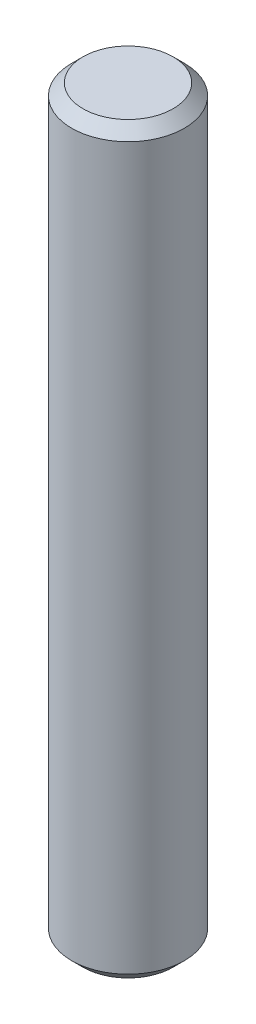
ISO-10303-21;
HEADER;
FILE_DESCRIPTION(('STEP AP214'),'2;1');
FILE_NAME('part.step','',(''),(''),'','','');
FILE_SCHEMA(('AUTOMOTIVE_DESIGN { 1 0 10303 214 1 1 1 1 }'));
ENDSEC;
DATA;
#1=APPLICATION_CONTEXT('core data for automotive mechanical design processes');
#2=APPLICATION_PROTOCOL_DEFINITION('international standard','automotive_design',2000,#1);
#3=PRODUCT_CONTEXT('',#1,'mechanical');
#4=PRODUCT('Part','Part','',(#3));
#5=PRODUCT_RELATED_PRODUCT_CATEGORY('part','',(#4));
#6=PRODUCT_DEFINITION_FORMATION('','',#4);
#7=PRODUCT_DEFINITION_CONTEXT('part definition',#1,'design');
#8=PRODUCT_DEFINITION('design','',#6,#7);
#9=PRODUCT_DEFINITION_SHAPE('','',#8);
#10=(LENGTH_UNIT() NAMED_UNIT(*) SI_UNIT(.MILLI.,.METRE.));
#11=(NAMED_UNIT(*) PLANE_ANGLE_UNIT() SI_UNIT($,.RADIAN.));
#12=(NAMED_UNIT(*) SI_UNIT($,.STERADIAN.) SOLID_ANGLE_UNIT());
#13=UNCERTAINTY_MEASURE_WITH_UNIT(LENGTH_MEASURE(1.E-05),#10,'distance_accuracy_value','');
#14=(GEOMETRIC_REPRESENTATION_CONTEXT(3) GLOBAL_UNCERTAINTY_ASSIGNED_CONTEXT((#13)) GLOBAL_UNIT_ASSIGNED_CONTEXT((#10,
#11,#12)) REPRESENTATION_CONTEXT('',''));
#15=CARTESIAN_POINT('',(0.,0.,0.));
#16=DIRECTION('',(0.,0.,1.));
#17=DIRECTION('',(1.,0.,0.));
#18=AXIS2_PLACEMENT_3D('',#15,#16,#17);
#19=CARTESIAN_POINT('',(0.,41.91,0.));
#20=DIRECTION('',(0.,-1.,0.));
#21=DIRECTION('',(0.,0.,-1.));
#22=AXIS2_PLACEMENT_3D('',#19,#20,#21);
#23=CYLINDRICAL_SURFACE('',#22,3.175);
#24=CARTESIAN_POINT('',(0.,0.635000000000004,0.));
#25=DIRECTION('',(0.,1.,0.));
#26=DIRECTION('',(0.,0.,1.));
#27=AXIS2_PLACEMENT_3D('',#24,#25,#26);
#28=CIRCLE('',#27,3.175);
#29=CARTESIAN_POINT('',(0.,0.635000000000004,3.175));
#30=VERTEX_POINT('',#29);
#31=EDGE_CURVE('E59',#30,#30,#28,.T.);
#32=ORIENTED_EDGE('',*,*,#31,.T.);
#33=EDGE_LOOP('',(#32));
#34=FACE_BOUND('',#33,.T.);
#35=CARTESIAN_POINT('',(0.,41.275,0.));
#36=DIRECTION('',(0.,1.,0.));
#37=DIRECTION('',(0.,0.,1.));
#38=AXIS2_PLACEMENT_3D('',#35,#36,#37);
#39=CIRCLE('',#38,3.175);
#40=CARTESIAN_POINT('',(0.,41.275,-3.175));
#41=VERTEX_POINT('',#40);
#42=EDGE_CURVE('E64',#41,#41,#39,.F.);
#43=ORIENTED_EDGE('',*,*,#42,.T.);
#44=EDGE_LOOP('',(#43));
#45=FACE_BOUND('',#44,.T.);
#46=ADVANCED_FACE('F45',(#34,#45),#23,.T.);
#47=CARTESIAN_POINT('',(0.,41.91,0.));
#48=DIRECTION('',(0.,1.,0.));
#49=DIRECTION('',(0.,0.,1.));
#50=AXIS2_PLACEMENT_3D('',#47,#48,#49);
#51=PLANE('',#50);
#52=CARTESIAN_POINT('',(0.,41.91,0.));
#53=DIRECTION('',(0.,1.,0.));
#54=DIRECTION('',(0.,0.,1.));
#55=AXIS2_PLACEMENT_3D('',#52,#53,#54);
#56=CIRCLE('',#55,2.54000000000001);
#57=CARTESIAN_POINT('',(0.,41.91,-2.54000000000001));
#58=VERTEX_POINT('',#57);
#59=EDGE_CURVE('E10',#58,#58,#56,.T.);
#60=ORIENTED_EDGE('',*,*,#59,.T.);
#61=EDGE_LOOP('',(#60));
#62=FACE_BOUND('',#61,.T.);
#63=ADVANCED_FACE('F81',(#62),#51,.T.);
#64=CARTESIAN_POINT('',(0.,0.,0.));
#65=DIRECTION('',(0.,1.,0.));
#66=DIRECTION('',(0.,0.,1.));
#67=AXIS2_PLACEMENT_3D('',#64,#65,#66);
#68=PLANE('',#67);
#69=CARTESIAN_POINT('',(0.,0.,0.));
#70=DIRECTION('',(0.,1.,0.));
#71=DIRECTION('',(0.,0.,1.));
#72=AXIS2_PLACEMENT_3D('',#69,#70,#71);
#73=CIRCLE('',#72,2.53999999999999);
#74=CARTESIAN_POINT('',(0.,0.,2.53999999999999));
#75=VERTEX_POINT('',#74);
#76=EDGE_CURVE('E54',#75,#75,#73,.F.);
#77=ORIENTED_EDGE('',*,*,#76,.T.);
#78=EDGE_LOOP('',(#77));
#79=FACE_BOUND('',#78,.T.);
#80=ADVANCED_FACE('F78',(#79),#68,.F.);
#81=CARTESIAN_POINT('',(0.,0.635000000000004,0.));
#82=DIRECTION('',(0.,1.,0.));
#83=DIRECTION('',(0.,0.,1.));
#84=AXIS2_PLACEMENT_3D('',#81,#82,#83);
#85=CONICAL_SURFACE('',#84,3.175,0.785398163397453);
#86=ORIENTED_EDGE('',*,*,#76,.F.);
#87=EDGE_LOOP('',(#86));
#88=FACE_BOUND('',#87,.T.);
#89=ORIENTED_EDGE('',*,*,#31,.F.);
#90=EDGE_LOOP('',(#89));
#91=FACE_BOUND('',#90,.T.);
#92=ADVANCED_FACE('F74',(#88,#91),#85,.T.);
#93=CARTESIAN_POINT('',(0.,41.91,0.));
#94=DIRECTION('',(0.,-1.,0.));
#95=DIRECTION('',(0.,0.,-1.));
#96=AXIS2_PLACEMENT_3D('',#93,#94,#95);
#97=CONICAL_SURFACE('',#96,2.54000000000001,0.785398163397453);
#98=CARTESIAN_POINT('',(0.,41.275,-3.175));
#99=CARTESIAN_POINT('',(0.,41.2816145833334,-3.16838541666667));
#100=CARTESIAN_POINT('',(0.,41.2882291666667,-3.16177083333334));
#101=CARTESIAN_POINT('',(0.,41.3014583333333,-3.14854166666667));
#102=CARTESIAN_POINT('',(0.,41.3080729166667,-3.14192708333334));
#103=CARTESIAN_POINT('',(0.,41.3213020833333,-3.12869791666667));
#104=CARTESIAN_POINT('',(0.,41.3279166666667,-3.12208333333334));
#105=CARTESIAN_POINT('',(0.,41.3411458333333,-3.10885416666667));
#106=CARTESIAN_POINT('',(0.,41.3477604166667,-3.10223958333334));
#107=CARTESIAN_POINT('',(0.,41.3609895833333,-3.08901041666667));
#108=CARTESIAN_POINT('',(0.,41.3676041666667,-3.08239583333334));
#109=CARTESIAN_POINT('',(0.,41.3808333333333,-3.06916666666667));
#110=CARTESIAN_POINT('',(0.,41.3874479166667,-3.06255208333334));
#111=CARTESIAN_POINT('',(0.,41.4006770833333,-3.04932291666667));
#112=CARTESIAN_POINT('',(0.,41.4072916666667,-3.04270833333334));
#113=CARTESIAN_POINT('',(0.,41.4205208333333,-3.02947916666667));
#114=CARTESIAN_POINT('',(0.,41.4271354166667,-3.02286458333334));
#115=CARTESIAN_POINT('',(0.,41.4403645833333,-3.00963541666667));
#116=CARTESIAN_POINT('',(0.,41.4469791666667,-3.00302083333334));
#117=CARTESIAN_POINT('',(0.,41.4602083333333,-2.98979166666667));
#118=CARTESIAN_POINT('',(0.,41.4668229166667,-2.98317708333334));
#119=CARTESIAN_POINT('',(0.,41.4800520833333,-2.96994791666667));
#120=CARTESIAN_POINT('',(0.,41.4866666666667,-2.96333333333334));
#121=CARTESIAN_POINT('',(0.,41.4998958333333,-2.95010416666667));
#122=CARTESIAN_POINT('',(0.,41.5065104166667,-2.94348958333334));
#123=CARTESIAN_POINT('',(0.,41.5197395833333,-2.93026041666667));
#124=CARTESIAN_POINT('',(0.,41.5263541666667,-2.92364583333334));
#125=CARTESIAN_POINT('',(0.,41.5395833333333,-2.91041666666667));
#126=CARTESIAN_POINT('',(0.,41.5461979166667,-2.90380208333334));
#127=CARTESIAN_POINT('',(0.,41.5594270833333,-2.89057291666668));
#128=CARTESIAN_POINT('',(0.,41.5660416666667,-2.88395833333334));
#129=CARTESIAN_POINT('',(0.,41.5792708333333,-2.87072916666667));
#130=CARTESIAN_POINT('',(0.,41.5858854166667,-2.86411458333334));
#131=CARTESIAN_POINT('',(0.,41.5991145833333,-2.85088541666668));
#132=CARTESIAN_POINT('',(0.,41.6057291666667,-2.84427083333334));
#133=CARTESIAN_POINT('',(0.,41.6189583333333,-2.83104166666668));
#134=CARTESIAN_POINT('',(0.,41.6255729166667,-2.82442708333334));
#135=CARTESIAN_POINT('',(0.,41.6388020833333,-2.81119791666668));
#136=CARTESIAN_POINT('',(0.,41.6454166666667,-2.80458333333334));
#137=CARTESIAN_POINT('',(0.,41.6586458333333,-2.79135416666668));
#138=CARTESIAN_POINT('',(0.,41.6652604166667,-2.78473958333334));
#139=CARTESIAN_POINT('',(0.,41.6784895833333,-2.77151041666668));
#140=CARTESIAN_POINT('',(0.,41.6851041666667,-2.76489583333334));
#141=CARTESIAN_POINT('',(0.,41.6983333333333,-2.75166666666668));
#142=CARTESIAN_POINT('',(0.,41.7049479166667,-2.74505208333334));
#143=CARTESIAN_POINT('',(0.,41.7181770833333,-2.73182291666668));
#144=CARTESIAN_POINT('',(0.,41.7247916666667,-2.72520833333334));
#145=CARTESIAN_POINT('',(0.,41.7380208333333,-2.71197916666668));
#146=CARTESIAN_POINT('',(0.,41.7446354166667,-2.70536458333335));
#147=CARTESIAN_POINT('',(0.,41.7578645833333,-2.69213541666668));
#148=CARTESIAN_POINT('',(0.,41.7644791666667,-2.68552083333335));
#149=CARTESIAN_POINT('',(0.,41.7777083333333,-2.67229166666668));
#150=CARTESIAN_POINT('',(0.,41.7843229166667,-2.66567708333335));
#151=CARTESIAN_POINT('',(0.,41.7975520833333,-2.65244791666668));
#152=CARTESIAN_POINT('',(0.,41.8041666666667,-2.64583333333335));
#153=CARTESIAN_POINT('',(0.,41.8173958333333,-2.63260416666668));
#154=CARTESIAN_POINT('',(0.,41.8240104166667,-2.62598958333335));
#155=CARTESIAN_POINT('',(0.,41.8372395833333,-2.61276041666668));
#156=CARTESIAN_POINT('',(0.,41.8438541666667,-2.60614583333335));
#157=CARTESIAN_POINT('',(0.,41.8570833333333,-2.59291666666668));
#158=CARTESIAN_POINT('',(0.,41.8636979166667,-2.58630208333335));
#159=CARTESIAN_POINT('',(0.,41.8769270833333,-2.57307291666668));
#160=CARTESIAN_POINT('',(0.,41.8835416666667,-2.56645833333335));
#161=CARTESIAN_POINT('',(0.,41.8967708333333,-2.55322916666668));
#162=CARTESIAN_POINT('',(0.,41.9033854166667,-2.54661458333335));
#163=CARTESIAN_POINT('',(0.,41.91,-2.54000000000001));
#164=B_SPLINE_CURVE_WITH_KNOTS('',3,(#98,#99,#100,#101,#102,#103,#104,#105,#106,#107,#108,#109,
#110,#111,#112,#113,#114,#115,#116,#117,#118,#119,#120,#121,#122,#123,#124,#125,#126,#127,#128,
#129,#130,#131,#132,#133,#134,#135,#136,#137,#138,#139,#140,#141,#142,#143,#144,#145,#146,#147,
#148,#149,#150,#151,#152,#153,#154,#155,#156,#157,#158,#159,#160,#161,#162,#163),.UNSPECIFIED.,
.F.,.F.,(4,2,2,2,2,2,2,2,2,2,2,2,2,2,2,2,2,2,2,2,2,2,2,2,2,2,2,2,2,2,2,2,4),(0.,
0.0280633003783397,0.0561266007566792,0.0841899011350186,0.112253201513358,0.140316501891698,
0.168379802270042,0.196443102648382,0.224506403026722,0.252569703405061,0.2806330037834,
0.308696304161745,0.336759604540084,0.364822904918424,0.392886205296764,0.420949505675103,
0.449012806053448,0.477076106431787,0.505139406810127,0.533202707188466,0.561266007566806,
0.589329307945145,0.61739260832349,0.645455908701829,0.673519209080169,0.701582509458509,
0.729645809836848,0.757709110215193,0.785772410593532,0.813835710971872,0.841899011350211,
0.869962311728551,0.898025612106895),.UNSPECIFIED.);
#165=EDGE_CURVE('BSEAM48',#41,#58,#164,.T.);
#166=ORIENTED_EDGE('',*,*,#42,.F.);
#167=ORIENTED_EDGE('',*,*,#59,.F.);
#168=ORIENTED_EDGE('',*,*,#165,.T.);
#169=ORIENTED_EDGE('',*,*,#165,.F.);
#170=EDGE_LOOP('',(#166,#168,#167,#169));
#171=FACE_BOUND('',#170,.T.);
#172=ADVANCED_FACE('F48',(#171),#97,.T.);
#173=CLOSED_SHELL('',(#46,#63,#80,#92,#172));
#174=MANIFOLD_SOLID_BREP('B2',#173);
#175=ADVANCED_BREP_SHAPE_REPRESENTATION('',(#18,#174),#14);
#176=SHAPE_DEFINITION_REPRESENTATION(#9,#175);
ENDSEC;
END-ISO-10303-21;
